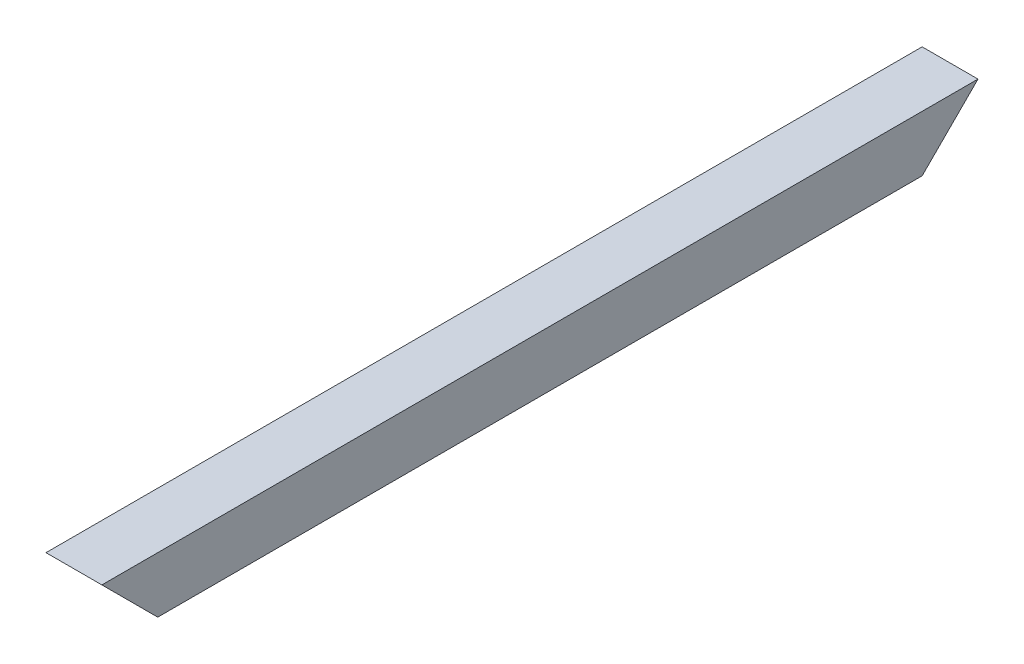
ISO-10303-21;
HEADER;
FILE_DESCRIPTION(('STEP AP214'),'2;1');
FILE_NAME('part.step','',(''),(''),'','','');
FILE_SCHEMA(('AUTOMOTIVE_DESIGN { 1 0 10303 214 1 1 1 1 }'));
ENDSEC;
DATA;
#1=APPLICATION_CONTEXT('core data for automotive mechanical design processes');
#2=APPLICATION_PROTOCOL_DEFINITION('international standard','automotive_design',2000,#1);
#3=PRODUCT_CONTEXT('',#1,'mechanical');
#4=PRODUCT('Part','Part','',(#3));
#5=PRODUCT_RELATED_PRODUCT_CATEGORY('part','',(#4));
#6=PRODUCT_DEFINITION_FORMATION('','',#4);
#7=PRODUCT_DEFINITION_CONTEXT('part definition',#1,'design');
#8=PRODUCT_DEFINITION('design','',#6,#7);
#9=PRODUCT_DEFINITION_SHAPE('','',#8);
#10=(LENGTH_UNIT() NAMED_UNIT(*) SI_UNIT(.MILLI.,.METRE.));
#11=(NAMED_UNIT(*) PLANE_ANGLE_UNIT() SI_UNIT($,.RADIAN.));
#12=(NAMED_UNIT(*) SI_UNIT($,.STERADIAN.) SOLID_ANGLE_UNIT());
#13=UNCERTAINTY_MEASURE_WITH_UNIT(LENGTH_MEASURE(1.E-05),#10,'distance_accuracy_value','');
#14=(GEOMETRIC_REPRESENTATION_CONTEXT(3) GLOBAL_UNCERTAINTY_ASSIGNED_CONTEXT((#13)) GLOBAL_UNIT_ASSIGNED_CONTEXT((#10,
#11,#12)) REPRESENTATION_CONTEXT('',''));
#15=CARTESIAN_POINT('',(0.,0.,0.));
#16=DIRECTION('',(0.,0.,1.));
#17=DIRECTION('',(1.,0.,0.));
#18=AXIS2_PLACEMENT_3D('',#15,#16,#17);
#19=CARTESIAN_POINT('',(13.7376133090045,182.237613309005,476.237613309004));
#20=DIRECTION('',(0.,-0.707106781186548,0.707106781186547));
#21=DIRECTION('',(0.,-0.707106781186547,-0.707106781186548));
#22=AXIS2_PLACEMENT_3D('',#19,#20,#21);
#23=PLANE('',#22);
#24=DIRECTION('',(-1.,0.,0.));
#25=VECTOR('',#24,1.);
#26=CARTESIAN_POINT('',(-31.499999999993,200.,494.));
#27=LINE('',#26,#25);
#28=CARTESIAN_POINT('',(31.5000000000001,200.,494.));
#29=VERTEX_POINT('',#28);
#30=CARTESIAN_POINT('',(-31.4999999999999,200.,494.));
#31=VERTEX_POINT('',#30);
#32=EDGE_CURVE('E126',#29,#31,#27,.T.);
#33=ORIENTED_EDGE('',*,*,#32,.T.);
#34=DIRECTION('',(0.,-0.707106781186547,-0.707106781186548));
#35=VECTOR('',#34,1.);
#36=CARTESIAN_POINT('',(-31.5000000000036,-294.,-7.7715611723761E-13));
#37=LINE('',#36,#35);
#38=CARTESIAN_POINT('',(-31.4999999999999,196.3,490.3));
#39=VERTEX_POINT('',#38);
#40=EDGE_CURVE('E109',#31,#39,#37,.T.);
#41=ORIENTED_EDGE('',*,*,#40,.T.);
#42=CARTESIAN_POINT('',(-29.1999999999999,196.3,490.3));
#43=DIRECTION('',(0.,-0.707106781186548,0.707106781186547));
#44=DIRECTION('',(0.,0.707106781186547,0.707106781186548));
#45=AXIS2_PLACEMENT_3D('',#42,#43,#44);
#46=ELLIPSE('',#45,3.2526911934581,2.29999999999998);
#47=CARTESIAN_POINT('',(-29.2,194.,488.));
#48=VERTEX_POINT('',#47);
#49=EDGE_CURVE('E115',#39,#48,#46,.T.);
#50=ORIENTED_EDGE('',*,*,#49,.T.);
#51=DIRECTION('',(1.,0.,0.));
#52=VECTOR('',#51,1.);
#53=CARTESIAN_POINT('',(-29.1999999999931,194.,488.));
#54=LINE('',#53,#52);
#55=CARTESIAN_POINT('',(18.5,194.,488.));
#56=VERTEX_POINT('',#55);
#57=EDGE_CURVE('E122',#48,#56,#54,.T.);
#58=ORIENTED_EDGE('',*,*,#57,.T.);
#59=CARTESIAN_POINT('',(18.5,187.,481.));
#60=DIRECTION('',(0.,-0.707106781186548,0.707106781186547));
#61=DIRECTION('',(0.,0.707106781186547,0.707106781186548));
#62=AXIS2_PLACEMENT_3D('',#59,#60,#61);
#63=ELLIPSE('',#62,9.89949493661168,7.);
#64=CARTESIAN_POINT('',(25.5,187.,481.));
#65=VERTEX_POINT('',#64);
#66=EDGE_CURVE('E142',#56,#65,#63,.F.);
#67=ORIENTED_EDGE('',*,*,#66,.T.);
#68=DIRECTION('',(0.,-0.707106781186547,-0.707106781186548));
#69=VECTOR('',#68,1.);
#70=CARTESIAN_POINT('',(25.4999999999966,-300.5,-6.50000000000101));
#71=LINE('',#70,#69);
#72=CARTESIAN_POINT('',(25.4999999999997,139.3,433.299999999999));
#73=VERTEX_POINT('',#72);
#74=EDGE_CURVE('E139',#65,#73,#71,.T.);
#75=ORIENTED_EDGE('',*,*,#74,.T.);
#76=CARTESIAN_POINT('',(27.7999999999997,139.3,433.3));
#77=DIRECTION('',(0.,-0.707106781186548,0.707106781186547));
#78=DIRECTION('',(0.,0.707106781186547,0.707106781186548));
#79=AXIS2_PLACEMENT_3D('',#76,#77,#78);
#80=ELLIPSE('',#79,3.25269119345814,2.30000000000001);
#81=CARTESIAN_POINT('',(27.7999999999996,137.,431.));
#82=VERTEX_POINT('',#81);
#83=EDGE_CURVE('E136',#73,#82,#80,.T.);
#84=ORIENTED_EDGE('',*,*,#83,.T.);
#85=DIRECTION('',(1.,0.,0.));
#86=VECTOR('',#85,1.);
#87=CARTESIAN_POINT('',(27.7999999999996,137.,431.));
#88=LINE('',#87,#86);
#89=CARTESIAN_POINT('',(31.4999999999996,137.,431.));
#90=VERTEX_POINT('',#89);
#91=EDGE_CURVE('E133',#82,#90,#88,.T.);
#92=ORIENTED_EDGE('',*,*,#91,.T.);
#93=DIRECTION('',(0.,0.707106781186547,0.707106781186548));
#94=VECTOR('',#93,1.);
#95=CARTESIAN_POINT('',(31.4999999999967,-294.,-9.99200722162641E-13));
#96=LINE('',#95,#94);
#97=EDGE_CURVE('E131',#90,#29,#96,.T.);
#98=ORIENTED_EDGE('',*,*,#97,.T.);
#99=EDGE_LOOP('',(#33,#41,#50,#58,#67,#75,#84,#92,#98));
#100=FACE_BOUND('',#99,.T.);
#101=ADVANCED_FACE('F34',(#100),#23,.T.);
#102=CARTESIAN_POINT('',(-29.1999999999999,196.3,-494.));
#103=DIRECTION('',(0.,0.,1.));
#104=DIRECTION('',(1.,0.,0.));
#105=AXIS2_PLACEMENT_3D('',#102,#103,#104);
#106=CYLINDRICAL_SURFACE('',#105,2.29999999999998);
#107=DIRECTION('',(0.,0.,1.));
#108=VECTOR('',#107,1.);
#109=CARTESIAN_POINT('',(-31.4999999999999,196.3,-494.));
#110=LINE('',#109,#108);
#111=CARTESIAN_POINT('',(-31.4999999999999,196.3,-490.300000000001));
#112=VERTEX_POINT('',#111);
#113=EDGE_CURVE('E104',#112,#39,#110,.T.);
#114=ORIENTED_EDGE('',*,*,#113,.F.);
#115=CARTESIAN_POINT('',(-29.1999999999999,196.3,-490.300000000001));
#116=DIRECTION('',(0.,0.707106781186548,0.707106781186548));
#117=DIRECTION('',(0.,-0.707106781186548,0.707106781186548));
#118=AXIS2_PLACEMENT_3D('',#115,#116,#117);
#119=ELLIPSE('',#118,3.25269119345809,2.29999999999998);
#120=CARTESIAN_POINT('',(-29.2,194.,-488.000000000001));
#121=VERTEX_POINT('',#120);
#122=EDGE_CURVE('E37',#112,#121,#119,.T.);
#123=ORIENTED_EDGE('',*,*,#122,.T.);
#124=DIRECTION('',(0.,0.,1.));
#125=VECTOR('',#124,1.);
#126=CARTESIAN_POINT('',(-29.2,194.,-494.));
#127=LINE('',#126,#125);
#128=EDGE_CURVE('E118',#121,#48,#127,.T.);
#129=ORIENTED_EDGE('',*,*,#128,.T.);
#130=ORIENTED_EDGE('',*,*,#49,.F.);
#131=EDGE_LOOP('',(#114,#123,#129,#130));
#132=FACE_BOUND('',#131,.T.);
#133=ADVANCED_FACE('F116',(#132),#106,.T.);
#134=CARTESIAN_POINT('',(-29.2,194.,-494.));
#135=DIRECTION('',(0.,1.,0.));
#136=DIRECTION('',(-1.,0.,0.));
#137=AXIS2_PLACEMENT_3D('',#134,#135,#136);
#138=PLANE('',#137);
#139=ORIENTED_EDGE('',*,*,#128,.F.);
#140=DIRECTION('',(1.,0.,0.));
#141=VECTOR('',#140,1.);
#142=CARTESIAN_POINT('',(-29.2,194.,-488.000000000001));
#143=LINE('',#142,#141);
#144=CARTESIAN_POINT('',(18.5,194.,-488.));
#145=VERTEX_POINT('',#144);
#146=EDGE_CURVE('E164',#121,#145,#143,.T.);
#147=ORIENTED_EDGE('',*,*,#146,.T.);
#148=DIRECTION('',(0.,0.,1.));
#149=VECTOR('',#148,1.);
#150=CARTESIAN_POINT('',(18.5,194.,-494.));
#151=LINE('',#150,#149);
#152=EDGE_CURVE('E157',#145,#56,#151,.T.);
#153=ORIENTED_EDGE('',*,*,#152,.T.);
#154=ORIENTED_EDGE('',*,*,#57,.F.);
#155=EDGE_LOOP('',(#139,#147,#153,#154));
#156=FACE_BOUND('',#155,.T.);
#157=ADVANCED_FACE('F163',(#156),#138,.F.);
#158=CARTESIAN_POINT('',(18.5,187.,-494.));
#159=DIRECTION('',(0.,0.,1.));
#160=DIRECTION('',(1.,0.,0.));
#161=AXIS2_PLACEMENT_3D('',#158,#159,#160);
#162=CYLINDRICAL_SURFACE('',#161,7.);
#163=ORIENTED_EDGE('',*,*,#152,.F.);
#164=CARTESIAN_POINT('',(18.5,187.,-481.));
#165=DIRECTION('',(0.,0.707106781186548,0.707106781186548));
#166=DIRECTION('',(0.,-0.707106781186548,0.707106781186548));
#167=AXIS2_PLACEMENT_3D('',#164,#165,#166);
#168=ELLIPSE('',#167,9.89949493661167,7.);
#169=CARTESIAN_POINT('',(25.5,187.,-481.));
#170=VERTEX_POINT('',#169);
#171=EDGE_CURVE('E196',#145,#170,#168,.F.);
#172=ORIENTED_EDGE('',*,*,#171,.T.);
#173=DIRECTION('',(0.,0.,1.));
#174=VECTOR('',#173,1.);
#175=CARTESIAN_POINT('',(25.5,187.,-494.));
#176=LINE('',#175,#174);
#177=EDGE_CURVE('E155',#170,#65,#176,.T.);
#178=ORIENTED_EDGE('',*,*,#177,.T.);
#179=ORIENTED_EDGE('',*,*,#66,.F.);
#180=EDGE_LOOP('',(#163,#172,#178,#179));
#181=FACE_BOUND('',#180,.T.);
#182=ADVANCED_FACE('F167',(#181),#162,.F.);
#183=CARTESIAN_POINT('',(25.5,187.,-494.));
#184=DIRECTION('',(1.,0.,0.));
#185=DIRECTION('',(0.,1.,0.));
#186=AXIS2_PLACEMENT_3D('',#183,#184,#185);
#187=PLANE('',#186);
#188=ORIENTED_EDGE('',*,*,#177,.F.);
#189=DIRECTION('',(0.,-0.707106781186548,0.707106781186548));
#190=VECTOR('',#189,1.);
#191=CARTESIAN_POINT('',(25.5,193.5,-487.5));
#192=LINE('',#191,#190);
#193=CARTESIAN_POINT('',(25.4999999999997,139.3,-433.3));
#194=VERTEX_POINT('',#193);
#195=EDGE_CURVE('E175',#170,#194,#192,.T.);
#196=ORIENTED_EDGE('',*,*,#195,.T.);
#197=DIRECTION('',(0.,0.,1.));
#198=VECTOR('',#197,1.);
#199=CARTESIAN_POINT('',(25.4999999999996,139.3,-494.));
#200=LINE('',#199,#198);
#201=EDGE_CURVE('E153',#194,#73,#200,.T.);
#202=ORIENTED_EDGE('',*,*,#201,.T.);
#203=ORIENTED_EDGE('',*,*,#74,.F.);
#204=EDGE_LOOP('',(#188,#196,#202,#203));
#205=FACE_BOUND('',#204,.T.);
#206=ADVANCED_FACE('F172',(#205),#187,.F.);
#207=CARTESIAN_POINT('',(27.7999999999997,139.3,-494.));
#208=DIRECTION('',(0.,0.,1.));
#209=DIRECTION('',(1.,0.,0.));
#210=AXIS2_PLACEMENT_3D('',#207,#208,#209);
#211=CYLINDRICAL_SURFACE('',#210,2.30000000000001);
#212=ORIENTED_EDGE('',*,*,#201,.F.);
#213=CARTESIAN_POINT('',(27.7999999999997,139.3,-433.3));
#214=DIRECTION('',(0.,0.707106781186548,0.707106781186548));
#215=DIRECTION('',(0.,-0.707106781186548,0.707106781186548));
#216=AXIS2_PLACEMENT_3D('',#213,#214,#215);
#217=ELLIPSE('',#216,3.25269119345814,2.30000000000001);
#218=CARTESIAN_POINT('',(27.7999999999996,137.,-431.));
#219=VERTEX_POINT('',#218);
#220=EDGE_CURVE('E181',#194,#219,#217,.T.);
#221=ORIENTED_EDGE('',*,*,#220,.T.);
#222=DIRECTION('',(0.,0.,1.));
#223=VECTOR('',#222,1.);
#224=CARTESIAN_POINT('',(27.7999999999996,137.,-494.));
#225=LINE('',#224,#223);
#226=EDGE_CURVE('E151',#219,#82,#225,.T.);
#227=ORIENTED_EDGE('',*,*,#226,.T.);
#228=ORIENTED_EDGE('',*,*,#83,.F.);
#229=EDGE_LOOP('',(#212,#221,#227,#228));
#230=FACE_BOUND('',#229,.T.);
#231=ADVANCED_FACE('F178',(#230),#211,.T.);
#232=CARTESIAN_POINT('',(27.7999999999996,137.,-494.));
#233=DIRECTION('',(0.,1.,0.));
#234=DIRECTION('',(0.,0.,1.));
#235=AXIS2_PLACEMENT_3D('',#232,#233,#234);
#236=PLANE('',#235);
#237=ORIENTED_EDGE('',*,*,#226,.F.);
#238=DIRECTION('',(1.,0.,0.));
#239=VECTOR('',#238,1.);
#240=CARTESIAN_POINT('',(27.7999999999996,137.,-431.));
#241=LINE('',#240,#239);
#242=CARTESIAN_POINT('',(31.4999999999996,137.,-431.));
#243=VERTEX_POINT('',#242);
#244=EDGE_CURVE('E190',#219,#243,#241,.T.);
#245=ORIENTED_EDGE('',*,*,#244,.T.);
#246=DIRECTION('',(0.,0.,1.));
#247=VECTOR('',#246,1.);
#248=CARTESIAN_POINT('',(31.4999999999996,137.,-494.));
#249=LINE('',#248,#247);
#250=EDGE_CURVE('E149',#243,#90,#249,.T.);
#251=ORIENTED_EDGE('',*,*,#250,.T.);
#252=ORIENTED_EDGE('',*,*,#91,.F.);
#253=EDGE_LOOP('',(#237,#245,#251,#252));
#254=FACE_BOUND('',#253,.T.);
#255=ADVANCED_FACE('F184',(#254),#236,.F.);
#256=CARTESIAN_POINT('',(31.5000000000001,200.,-494.));
#257=DIRECTION('',(-1.,0.,0.));
#258=DIRECTION('',(0.,-1.,0.));
#259=AXIS2_PLACEMENT_3D('',#256,#257,#258);
#260=PLANE('',#259);
#261=ORIENTED_EDGE('',*,*,#250,.F.);
#262=DIRECTION('',(0.,0.707106781186548,-0.707106781186548));
#263=VECTOR('',#262,1.);
#264=CARTESIAN_POINT('',(31.5000000000001,200.,-494.));
#265=LINE('',#264,#263);
#266=CARTESIAN_POINT('',(31.5000000000001,200.,-494.));
#267=VERTEX_POINT('',#266);
#268=EDGE_CURVE('E54',#243,#267,#265,.T.);
#269=ORIENTED_EDGE('',*,*,#268,.T.);
#270=DIRECTION('',(0.,0.,1.));
#271=VECTOR('',#270,1.);
#272=CARTESIAN_POINT('',(31.5000000000001,200.,-494.));
#273=LINE('',#272,#271);
#274=EDGE_CURVE('E147',#267,#29,#273,.T.);
#275=ORIENTED_EDGE('',*,*,#274,.T.);
#276=ORIENTED_EDGE('',*,*,#97,.F.);
#277=EDGE_LOOP('',(#261,#269,#275,#276));
#278=FACE_BOUND('',#277,.T.);
#279=ADVANCED_FACE('F187',(#278),#260,.F.);
#280=CARTESIAN_POINT('',(-31.4999999999999,200.,-494.));
#281=DIRECTION('',(0.,-1.,0.));
#282=DIRECTION('',(1.,0.,0.));
#283=AXIS2_PLACEMENT_3D('',#280,#281,#282);
#284=PLANE('',#283);
#285=ORIENTED_EDGE('',*,*,#274,.F.);
#286=DIRECTION('',(-1.,0.,0.));
#287=VECTOR('',#286,1.);
#288=CARTESIAN_POINT('',(-31.4999999999999,200.,-494.));
#289=LINE('',#288,#287);
#290=CARTESIAN_POINT('',(-31.4999999999999,200.,-494.));
#291=VERTEX_POINT('',#290);
#292=EDGE_CURVE('E42',#267,#291,#289,.T.);
#293=ORIENTED_EDGE('',*,*,#292,.T.);
#294=DIRECTION('',(0.,0.,1.));
#295=VECTOR('',#294,1.);
#296=CARTESIAN_POINT('',(-31.4999999999999,200.,-494.));
#297=LINE('',#296,#295);
#298=EDGE_CURVE('E113',#291,#31,#297,.T.);
#299=ORIENTED_EDGE('',*,*,#298,.T.);
#300=ORIENTED_EDGE('',*,*,#32,.F.);
#301=EDGE_LOOP('',(#285,#293,#299,#300));
#302=FACE_BOUND('',#301,.T.);
#303=ADVANCED_FACE('F189',(#302),#284,.F.);
#304=CARTESIAN_POINT('',(-31.4999999999999,200.,-494.));
#305=DIRECTION('',(1.,0.,0.));
#306=DIRECTION('',(0.,1.,0.));
#307=AXIS2_PLACEMENT_3D('',#304,#305,#306);
#308=PLANE('',#307);
#309=ORIENTED_EDGE('',*,*,#298,.F.);
#310=DIRECTION('',(0.,-0.707106781186548,0.707106781186548));
#311=VECTOR('',#310,1.);
#312=CARTESIAN_POINT('',(-31.4999999999999,200.,-494.));
#313=LINE('',#312,#311);
#314=EDGE_CURVE('E11',#291,#112,#313,.T.);
#315=ORIENTED_EDGE('',*,*,#314,.T.);
#316=ORIENTED_EDGE('',*,*,#113,.T.);
#317=ORIENTED_EDGE('',*,*,#40,.F.);
#318=EDGE_LOOP('',(#309,#315,#316,#317));
#319=FACE_BOUND('',#318,.T.);
#320=ADVANCED_FACE('F107',(#319),#308,.F.);
#321=CARTESIAN_POINT('',(13.8543765390642,182.354376539064,-476.354376539065));
#322=DIRECTION('',(0.,0.707106781186548,0.707106781186548));
#323=DIRECTION('',(0.,-0.707106781186548,0.707106781186548));
#324=AXIS2_PLACEMENT_3D('',#321,#322,#323);
#325=PLANE('',#324);
#326=ORIENTED_EDGE('',*,*,#292,.F.);
#327=ORIENTED_EDGE('',*,*,#268,.F.);
#328=ORIENTED_EDGE('',*,*,#244,.F.);
#329=ORIENTED_EDGE('',*,*,#220,.F.);
#330=ORIENTED_EDGE('',*,*,#195,.F.);
#331=ORIENTED_EDGE('',*,*,#171,.F.);
#332=ORIENTED_EDGE('',*,*,#146,.F.);
#333=ORIENTED_EDGE('',*,*,#122,.F.);
#334=ORIENTED_EDGE('',*,*,#314,.F.);
#335=EDGE_LOOP('',(#326,#327,#328,#329,#330,#331,#332,#333,#334));
#336=FACE_BOUND('',#335,.T.);
#337=ADVANCED_FACE('F198',(#336),#325,.F.);
#338=CLOSED_SHELL('',(#101,#133,#157,#182,#206,#231,#255,#279,#303,#320,#337));
#339=MANIFOLD_SOLID_BREP('B2',#338);
#340=ADVANCED_BREP_SHAPE_REPRESENTATION('',(#18,#339),#14);
#341=SHAPE_DEFINITION_REPRESENTATION(#9,#340);
ENDSEC;
END-ISO-10303-21;
